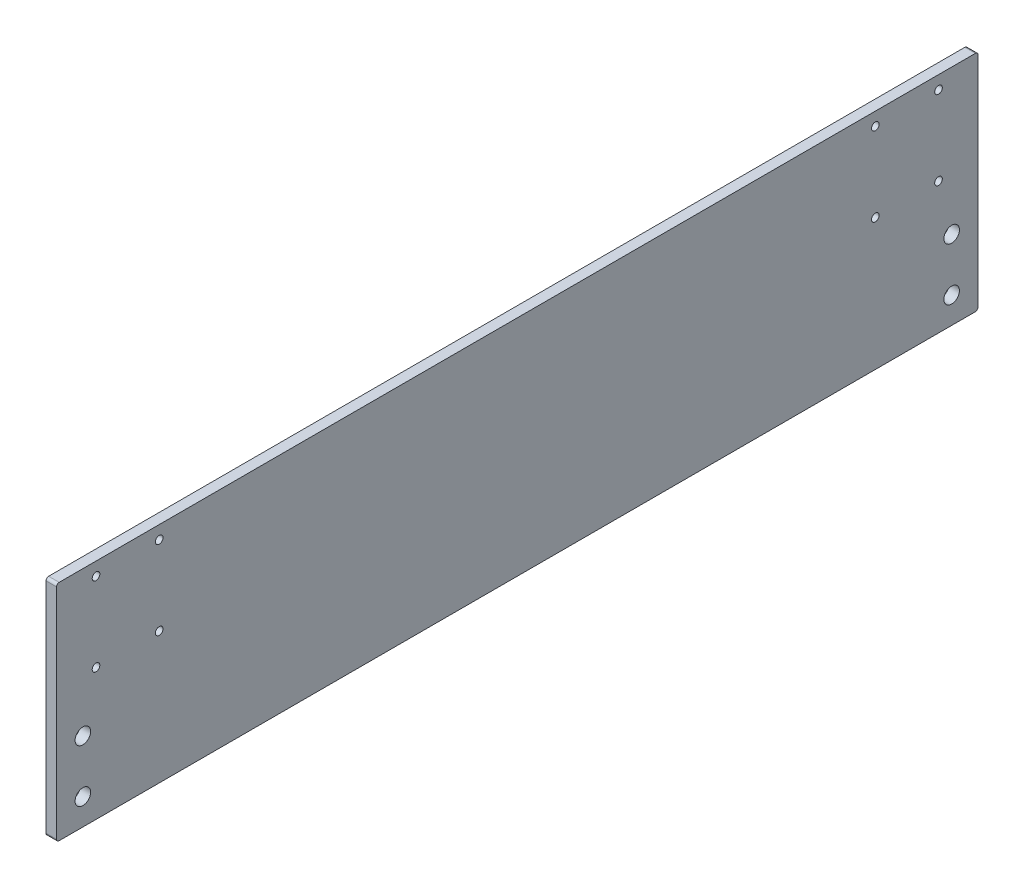
ISO-10303-21;
HEADER;
FILE_DESCRIPTION(('STEP AP214'),'2;1');
FILE_NAME('part.step','',(''),(''),'','','');
FILE_SCHEMA(('AUTOMOTIVE_DESIGN { 1 0 10303 214 1 1 1 1 }'));
ENDSEC;
DATA;
#1=APPLICATION_CONTEXT('core data for automotive mechanical design processes');
#2=APPLICATION_PROTOCOL_DEFINITION('international standard','automotive_design',2000,#1);
#3=PRODUCT_CONTEXT('',#1,'mechanical');
#4=PRODUCT('Part','Part','',(#3));
#5=PRODUCT_RELATED_PRODUCT_CATEGORY('part','',(#4));
#6=PRODUCT_DEFINITION_FORMATION('','',#4);
#7=PRODUCT_DEFINITION_CONTEXT('part definition',#1,'design');
#8=PRODUCT_DEFINITION('design','',#6,#7);
#9=PRODUCT_DEFINITION_SHAPE('','',#8);
#10=(LENGTH_UNIT() NAMED_UNIT(*) SI_UNIT(.MILLI.,.METRE.));
#11=(NAMED_UNIT(*) PLANE_ANGLE_UNIT() SI_UNIT($,.RADIAN.));
#12=(NAMED_UNIT(*) SI_UNIT($,.STERADIAN.) SOLID_ANGLE_UNIT());
#13=UNCERTAINTY_MEASURE_WITH_UNIT(LENGTH_MEASURE(1.E-05),#10,'distance_accuracy_value','');
#14=(GEOMETRIC_REPRESENTATION_CONTEXT(3) GLOBAL_UNCERTAINTY_ASSIGNED_CONTEXT((#13)) GLOBAL_UNIT_ASSIGNED_CONTEXT((#10,
#11,#12)) REPRESENTATION_CONTEXT('',''));
#15=CARTESIAN_POINT('',(0.,0.,0.));
#16=DIRECTION('',(0.,0.,1.));
#17=DIRECTION('',(1.,0.,0.));
#18=AXIS2_PLACEMENT_3D('',#15,#16,#17);
#19=CARTESIAN_POINT('',(4.,0.,0.));
#20=DIRECTION('',(-1.,0.,0.));
#21=DIRECTION('',(0.,0.,1.));
#22=AXIS2_PLACEMENT_3D('',#19,#20,#21);
#23=PLANE('',#22);
#24=DIRECTION('',(0.,0.,-1.));
#25=VECTOR('',#24,1.);
#26=CARTESIAN_POINT('',(4.,0.,0.));
#27=LINE('',#26,#25);
#28=CARTESIAN_POINT('',(4.,0.,-1.));
#29=VERTEX_POINT('',#28);
#30=CARTESIAN_POINT('',(4.,0.,-349.));
#31=VERTEX_POINT('',#30);
#32=EDGE_CURVE('E173',#29,#31,#27,.T.);
#33=ORIENTED_EDGE('',*,*,#32,.T.);
#34=CARTESIAN_POINT('',(4.,1.00000000000004,-349.));
#35=DIRECTION('',(-1.,0.,0.));
#36=DIRECTION('',(0.,0.,1.));
#37=AXIS2_PLACEMENT_3D('',#34,#35,#36);
#38=CIRCLE('',#37,1.);
#39=CARTESIAN_POINT('',(4.,1.00000000000004,-350.));
#40=VERTEX_POINT('',#39);
#41=EDGE_CURVE('E150',#31,#40,#38,.F.);
#42=ORIENTED_EDGE('',*,*,#41,.T.);
#43=DIRECTION('',(0.,1.,0.));
#44=VECTOR('',#43,1.);
#45=CARTESIAN_POINT('',(4.,0.,-350.));
#46=LINE('',#45,#44);
#47=CARTESIAN_POINT('',(4.,84.,-350.));
#48=VERTEX_POINT('',#47);
#49=EDGE_CURVE('E120',#40,#48,#46,.T.);
#50=ORIENTED_EDGE('',*,*,#49,.T.);
#51=CARTESIAN_POINT('',(4.,84.,-349.));
#52=DIRECTION('',(-1.,0.,0.));
#53=DIRECTION('',(0.,0.,1.));
#54=AXIS2_PLACEMENT_3D('',#51,#52,#53);
#55=CIRCLE('',#54,1.);
#56=CARTESIAN_POINT('',(4.,85.,-349.));
#57=VERTEX_POINT('',#56);
#58=EDGE_CURVE('E57',#48,#57,#55,.F.);
#59=ORIENTED_EDGE('',*,*,#58,.T.);
#60=DIRECTION('',(0.,0.,1.));
#61=VECTOR('',#60,1.);
#62=CARTESIAN_POINT('',(4.,85.,0.));
#63=LINE('',#62,#61);
#64=CARTESIAN_POINT('',(4.,85.,-1.));
#65=VERTEX_POINT('',#64);
#66=EDGE_CURVE('E136',#57,#65,#63,.T.);
#67=ORIENTED_EDGE('',*,*,#66,.T.);
#68=CARTESIAN_POINT('',(4.,84.,-1.));
#69=DIRECTION('',(-1.,0.,0.));
#70=DIRECTION('',(0.,0.,1.));
#71=AXIS2_PLACEMENT_3D('',#68,#69,#70);
#72=CIRCLE('',#71,1.);
#73=CARTESIAN_POINT('',(4.,84.,0.));
#74=VERTEX_POINT('',#73);
#75=EDGE_CURVE('E145',#65,#74,#72,.F.);
#76=ORIENTED_EDGE('',*,*,#75,.T.);
#77=DIRECTION('',(0.,-1.,0.));
#78=VECTOR('',#77,1.);
#79=CARTESIAN_POINT('',(4.,0.,0.));
#80=LINE('',#79,#78);
#81=CARTESIAN_POINT('',(4.,1.,0.));
#82=VERTEX_POINT('',#81);
#83=EDGE_CURVE('E130',#74,#82,#80,.T.);
#84=ORIENTED_EDGE('',*,*,#83,.T.);
#85=CARTESIAN_POINT('',(4.,1.,-1.));
#86=DIRECTION('',(-1.,0.,0.));
#87=DIRECTION('',(0.,0.,1.));
#88=AXIS2_PLACEMENT_3D('',#85,#86,#87);
#89=CIRCLE('',#88,1.);
#90=EDGE_CURVE('E147',#82,#29,#89,.F.);
#91=ORIENTED_EDGE('',*,*,#90,.T.);
#92=EDGE_LOOP('',(#33,#42,#50,#59,#67,#76,#84,#91));
#93=FACE_BOUND('',#92,.T.);
#94=CARTESIAN_POINT('',(4.,30.,-10.));
#95=DIRECTION('',(1.,0.,0.));
#96=DIRECTION('',(0.,0.,-1.));
#97=AXIS2_PLACEMENT_3D('',#94,#95,#96);
#98=CIRCLE('',#97,2.95);
#99=CARTESIAN_POINT('',(4.,30.,-12.95));
#100=VERTEX_POINT('',#99);
#101=EDGE_CURVE('E166',#100,#100,#98,.T.);
#102=ORIENTED_EDGE('',*,*,#101,.F.);
#103=EDGE_LOOP('',(#102));
#104=FACE_BOUND('',#103,.T.);
#105=CARTESIAN_POINT('',(4.,10.,-9.99999999999999));
#106=DIRECTION('',(1.,0.,0.));
#107=DIRECTION('',(0.,0.,-1.));
#108=AXIS2_PLACEMENT_3D('',#105,#106,#107);
#109=CIRCLE('',#108,2.95);
#110=CARTESIAN_POINT('',(4.,10.,-12.95));
#111=VERTEX_POINT('',#110);
#112=EDGE_CURVE('E178',#111,#111,#109,.T.);
#113=ORIENTED_EDGE('',*,*,#112,.F.);
#114=EDGE_LOOP('',(#113));
#115=FACE_BOUND('',#114,.T.);
#116=CARTESIAN_POINT('',(4.,80.,-15.));
#117=DIRECTION('',(1.,0.,0.));
#118=DIRECTION('',(0.,0.,-1.));
#119=AXIS2_PLACEMENT_3D('',#116,#117,#118);
#120=CIRCLE('',#119,1.45000000000001);
#121=CARTESIAN_POINT('',(4.,80.,-16.45));
#122=VERTEX_POINT('',#121);
#123=EDGE_CURVE('E183',#122,#122,#120,.T.);
#124=ORIENTED_EDGE('',*,*,#123,.F.);
#125=EDGE_LOOP('',(#124));
#126=FACE_BOUND('',#125,.T.);
#127=CARTESIAN_POINT('',(4.,80.,-39.));
#128=DIRECTION('',(1.,0.,0.));
#129=DIRECTION('',(0.,0.,-1.));
#130=AXIS2_PLACEMENT_3D('',#127,#128,#129);
#131=CIRCLE('',#130,1.45);
#132=CARTESIAN_POINT('',(4.,80.,-40.45));
#133=VERTEX_POINT('',#132);
#134=EDGE_CURVE('E189',#133,#133,#131,.T.);
#135=ORIENTED_EDGE('',*,*,#134,.F.);
#136=EDGE_LOOP('',(#135));
#137=FACE_BOUND('',#136,.T.);
#138=CARTESIAN_POINT('',(4.,50.,-15.));
#139=DIRECTION('',(1.,0.,0.));
#140=DIRECTION('',(0.,0.,-1.));
#141=AXIS2_PLACEMENT_3D('',#138,#139,#140);
#142=CIRCLE('',#141,1.45);
#143=CARTESIAN_POINT('',(4.,50.,-16.45));
#144=VERTEX_POINT('',#143);
#145=EDGE_CURVE('E195',#144,#144,#142,.T.);
#146=ORIENTED_EDGE('',*,*,#145,.F.);
#147=EDGE_LOOP('',(#146));
#148=FACE_BOUND('',#147,.T.);
#149=CARTESIAN_POINT('',(4.,50.,-39.));
#150=DIRECTION('',(1.,0.,0.));
#151=DIRECTION('',(0.,0.,-1.));
#152=AXIS2_PLACEMENT_3D('',#149,#150,#151);
#153=CIRCLE('',#152,1.45);
#154=CARTESIAN_POINT('',(4.,50.,-40.45));
#155=VERTEX_POINT('',#154);
#156=EDGE_CURVE('E201',#155,#155,#153,.T.);
#157=ORIENTED_EDGE('',*,*,#156,.F.);
#158=EDGE_LOOP('',(#157));
#159=FACE_BOUND('',#158,.T.);
#160=CARTESIAN_POINT('',(4.,50.,-311.));
#161=DIRECTION('',(1.,0.,0.));
#162=DIRECTION('',(0.,0.,1.));
#163=AXIS2_PLACEMENT_3D('',#160,#161,#162);
#164=CIRCLE('',#163,1.45);
#165=CARTESIAN_POINT('',(4.,50.,-309.55));
#166=VERTEX_POINT('',#165);
#167=EDGE_CURVE('E207',#166,#166,#164,.T.);
#168=ORIENTED_EDGE('',*,*,#167,.F.);
#169=EDGE_LOOP('',(#168));
#170=FACE_BOUND('',#169,.T.);
#171=CARTESIAN_POINT('',(4.,50.,-335.));
#172=DIRECTION('',(1.,0.,0.));
#173=DIRECTION('',(0.,0.,1.));
#174=AXIS2_PLACEMENT_3D('',#171,#172,#173);
#175=CIRCLE('',#174,1.45);
#176=CARTESIAN_POINT('',(4.,50.,-333.55));
#177=VERTEX_POINT('',#176);
#178=EDGE_CURVE('E213',#177,#177,#175,.T.);
#179=ORIENTED_EDGE('',*,*,#178,.F.);
#180=EDGE_LOOP('',(#179));
#181=FACE_BOUND('',#180,.T.);
#182=CARTESIAN_POINT('',(4.,80.,-311.));
#183=DIRECTION('',(1.,0.,0.));
#184=DIRECTION('',(0.,0.,1.));
#185=AXIS2_PLACEMENT_3D('',#182,#183,#184);
#186=CIRCLE('',#185,1.45);
#187=CARTESIAN_POINT('',(4.,80.,-309.55));
#188=VERTEX_POINT('',#187);
#189=EDGE_CURVE('E219',#188,#188,#186,.T.);
#190=ORIENTED_EDGE('',*,*,#189,.F.);
#191=EDGE_LOOP('',(#190));
#192=FACE_BOUND('',#191,.T.);
#193=CARTESIAN_POINT('',(4.,80.,-335.));
#194=DIRECTION('',(1.,0.,0.));
#195=DIRECTION('',(0.,0.,1.));
#196=AXIS2_PLACEMENT_3D('',#193,#194,#195);
#197=CIRCLE('',#196,1.45);
#198=CARTESIAN_POINT('',(4.,80.,-333.55));
#199=VERTEX_POINT('',#198);
#200=EDGE_CURVE('E225',#199,#199,#197,.T.);
#201=ORIENTED_EDGE('',*,*,#200,.F.);
#202=EDGE_LOOP('',(#201));
#203=FACE_BOUND('',#202,.T.);
#204=CARTESIAN_POINT('',(4.,10.,-340.));
#205=DIRECTION('',(1.,0.,0.));
#206=DIRECTION('',(0.,0.,1.));
#207=AXIS2_PLACEMENT_3D('',#204,#205,#206);
#208=CIRCLE('',#207,2.94999999999997);
#209=CARTESIAN_POINT('',(4.,10.,-337.05));
#210=VERTEX_POINT('',#209);
#211=EDGE_CURVE('E231',#210,#210,#208,.T.);
#212=ORIENTED_EDGE('',*,*,#211,.F.);
#213=EDGE_LOOP('',(#212));
#214=FACE_BOUND('',#213,.T.);
#215=CARTESIAN_POINT('',(4.,30.,-340.));
#216=DIRECTION('',(1.,0.,0.));
#217=DIRECTION('',(0.,0.,1.));
#218=AXIS2_PLACEMENT_3D('',#215,#216,#217);
#219=CIRCLE('',#218,2.95000000000002);
#220=CARTESIAN_POINT('',(4.,30.,-337.05));
#221=VERTEX_POINT('',#220);
#222=EDGE_CURVE('E237',#221,#221,#219,.T.);
#223=ORIENTED_EDGE('',*,*,#222,.F.);
#224=EDGE_LOOP('',(#223));
#225=FACE_BOUND('',#224,.T.);
#226=ADVANCED_FACE('F35',(#93,#104,#115,#126,#137,#148,#159,#170,#181,#192,#203,#214,#225),#23,.F.);
#227=CARTESIAN_POINT('',(0.,0.,0.));
#228=DIRECTION('',(-1.,0.,0.));
#229=DIRECTION('',(0.,0.,1.));
#230=AXIS2_PLACEMENT_3D('',#227,#228,#229);
#231=PLANE('',#230);
#232=CARTESIAN_POINT('',(0.,10.,-340.));
#233=DIRECTION('',(1.,0.,0.));
#234=DIRECTION('',(0.,0.,1.));
#235=AXIS2_PLACEMENT_3D('',#232,#233,#234);
#236=CIRCLE('',#235,2.94999999999997);
#237=CARTESIAN_POINT('',(0.,10.,-337.05));
#238=VERTEX_POINT('',#237);
#239=EDGE_CURVE('E234',#238,#238,#236,.T.);
#240=ORIENTED_EDGE('',*,*,#239,.T.);
#241=EDGE_LOOP('',(#240));
#242=FACE_BOUND('',#241,.T.);
#243=CARTESIAN_POINT('',(0.,80.,-311.));
#244=DIRECTION('',(1.,0.,0.));
#245=DIRECTION('',(0.,0.,1.));
#246=AXIS2_PLACEMENT_3D('',#243,#244,#245);
#247=CIRCLE('',#246,1.45);
#248=CARTESIAN_POINT('',(0.,80.,-309.55));
#249=VERTEX_POINT('',#248);
#250=EDGE_CURVE('E222',#249,#249,#247,.T.);
#251=ORIENTED_EDGE('',*,*,#250,.T.);
#252=EDGE_LOOP('',(#251));
#253=FACE_BOUND('',#252,.T.);
#254=CARTESIAN_POINT('',(0.,50.,-311.));
#255=DIRECTION('',(1.,0.,0.));
#256=DIRECTION('',(0.,0.,1.));
#257=AXIS2_PLACEMENT_3D('',#254,#255,#256);
#258=CIRCLE('',#257,1.45);
#259=CARTESIAN_POINT('',(0.,50.,-309.55));
#260=VERTEX_POINT('',#259);
#261=EDGE_CURVE('E210',#260,#260,#258,.T.);
#262=ORIENTED_EDGE('',*,*,#261,.T.);
#263=EDGE_LOOP('',(#262));
#264=FACE_BOUND('',#263,.T.);
#265=CARTESIAN_POINT('',(0.,50.,-15.));
#266=DIRECTION('',(1.,0.,0.));
#267=DIRECTION('',(0.,0.,-1.));
#268=AXIS2_PLACEMENT_3D('',#265,#266,#267);
#269=CIRCLE('',#268,1.45);
#270=CARTESIAN_POINT('',(0.,50.,-16.45));
#271=VERTEX_POINT('',#270);
#272=EDGE_CURVE('E198',#271,#271,#269,.T.);
#273=ORIENTED_EDGE('',*,*,#272,.T.);
#274=EDGE_LOOP('',(#273));
#275=FACE_BOUND('',#274,.T.);
#276=CARTESIAN_POINT('',(0.,80.,-15.));
#277=DIRECTION('',(1.,0.,0.));
#278=DIRECTION('',(0.,0.,-1.));
#279=AXIS2_PLACEMENT_3D('',#276,#277,#278);
#280=CIRCLE('',#279,1.45000000000001);
#281=CARTESIAN_POINT('',(0.,80.,-16.45));
#282=VERTEX_POINT('',#281);
#283=EDGE_CURVE('E186',#282,#282,#280,.T.);
#284=ORIENTED_EDGE('',*,*,#283,.T.);
#285=EDGE_LOOP('',(#284));
#286=FACE_BOUND('',#285,.T.);
#287=CARTESIAN_POINT('',(0.,30.,-10.));
#288=DIRECTION('',(1.,0.,0.));
#289=DIRECTION('',(0.,0.,-1.));
#290=AXIS2_PLACEMENT_3D('',#287,#288,#289);
#291=CIRCLE('',#290,2.95);
#292=CARTESIAN_POINT('',(0.,30.,-12.95));
#293=VERTEX_POINT('',#292);
#294=EDGE_CURVE('E168',#293,#293,#291,.T.);
#295=ORIENTED_EDGE('',*,*,#294,.T.);
#296=EDGE_LOOP('',(#295));
#297=FACE_BOUND('',#296,.T.);
#298=DIRECTION('',(0.,1.,0.));
#299=VECTOR('',#298,1.);
#300=CARTESIAN_POINT('',(0.,0.,-350.));
#301=LINE('',#300,#299);
#302=CARTESIAN_POINT('',(0.,1.00000000000004,-350.));
#303=VERTEX_POINT('',#302);
#304=CARTESIAN_POINT('',(0.,84.,-350.));
#305=VERTEX_POINT('',#304);
#306=EDGE_CURVE('E118',#303,#305,#301,.T.);
#307=ORIENTED_EDGE('',*,*,#306,.F.);
#308=CARTESIAN_POINT('',(0.,1.00000000000004,-349.));
#309=DIRECTION('',(-1.,0.,0.));
#310=DIRECTION('',(0.,0.,1.));
#311=AXIS2_PLACEMENT_3D('',#308,#309,#310);
#312=CIRCLE('',#311,1.);
#313=CARTESIAN_POINT('',(0.,0.,-349.));
#314=VERTEX_POINT('',#313);
#315=EDGE_CURVE('E101',#303,#314,#312,.T.);
#316=ORIENTED_EDGE('',*,*,#315,.T.);
#317=DIRECTION('',(0.,0.,-1.));
#318=VECTOR('',#317,1.);
#319=CARTESIAN_POINT('',(0.,0.,0.));
#320=LINE('',#319,#318);
#321=CARTESIAN_POINT('',(0.,0.,-1.));
#322=VERTEX_POINT('',#321);
#323=EDGE_CURVE('E128',#322,#314,#320,.T.);
#324=ORIENTED_EDGE('',*,*,#323,.F.);
#325=CARTESIAN_POINT('',(0.,1.,-1.));
#326=DIRECTION('',(-1.,0.,0.));
#327=DIRECTION('',(0.,0.,1.));
#328=AXIS2_PLACEMENT_3D('',#325,#326,#327);
#329=CIRCLE('',#328,1.);
#330=CARTESIAN_POINT('',(0.,1.,0.));
#331=VERTEX_POINT('',#330);
#332=EDGE_CURVE('E139',#322,#331,#329,.T.);
#333=ORIENTED_EDGE('',*,*,#332,.T.);
#334=DIRECTION('',(0.,-1.,0.));
#335=VECTOR('',#334,1.);
#336=CARTESIAN_POINT('',(0.,0.,0.));
#337=LINE('',#336,#335);
#338=CARTESIAN_POINT('',(0.,84.,0.));
#339=VERTEX_POINT('',#338);
#340=EDGE_CURVE('E132',#339,#331,#337,.T.);
#341=ORIENTED_EDGE('',*,*,#340,.F.);
#342=CARTESIAN_POINT('',(0.,84.,-1.));
#343=DIRECTION('',(-1.,0.,0.));
#344=DIRECTION('',(0.,0.,1.));
#345=AXIS2_PLACEMENT_3D('',#342,#343,#344);
#346=CIRCLE('',#345,1.);
#347=CARTESIAN_POINT('',(0.,85.,-1.));
#348=VERTEX_POINT('',#347);
#349=EDGE_CURVE('E121',#339,#348,#346,.T.);
#350=ORIENTED_EDGE('',*,*,#349,.T.);
#351=DIRECTION('',(0.,0.,1.));
#352=VECTOR('',#351,1.);
#353=CARTESIAN_POINT('',(0.,85.,0.));
#354=LINE('',#353,#352);
#355=CARTESIAN_POINT('',(0.,85.,-349.));
#356=VERTEX_POINT('',#355);
#357=EDGE_CURVE('E127',#356,#348,#354,.T.);
#358=ORIENTED_EDGE('',*,*,#357,.F.);
#359=CARTESIAN_POINT('',(0.,84.,-349.));
#360=DIRECTION('',(-1.,0.,0.));
#361=DIRECTION('',(0.,0.,1.));
#362=AXIS2_PLACEMENT_3D('',#359,#360,#361);
#363=CIRCLE('',#362,1.);
#364=EDGE_CURVE('E112',#356,#305,#363,.T.);
#365=ORIENTED_EDGE('',*,*,#364,.T.);
#366=EDGE_LOOP('',(#307,#316,#324,#333,#341,#350,#358,#365));
#367=FACE_BOUND('',#366,.T.);
#368=CARTESIAN_POINT('',(0.,10.,-9.99999999999999));
#369=DIRECTION('',(1.,0.,0.));
#370=DIRECTION('',(0.,0.,-1.));
#371=AXIS2_PLACEMENT_3D('',#368,#369,#370);
#372=CIRCLE('',#371,2.95);
#373=CARTESIAN_POINT('',(0.,10.,-12.95));
#374=VERTEX_POINT('',#373);
#375=EDGE_CURVE('E180',#374,#374,#372,.T.);
#376=ORIENTED_EDGE('',*,*,#375,.T.);
#377=EDGE_LOOP('',(#376));
#378=FACE_BOUND('',#377,.T.);
#379=CARTESIAN_POINT('',(0.,80.,-39.));
#380=DIRECTION('',(1.,0.,0.));
#381=DIRECTION('',(0.,0.,-1.));
#382=AXIS2_PLACEMENT_3D('',#379,#380,#381);
#383=CIRCLE('',#382,1.45);
#384=CARTESIAN_POINT('',(0.,80.,-40.45));
#385=VERTEX_POINT('',#384);
#386=EDGE_CURVE('E192',#385,#385,#383,.T.);
#387=ORIENTED_EDGE('',*,*,#386,.T.);
#388=EDGE_LOOP('',(#387));
#389=FACE_BOUND('',#388,.T.);
#390=CARTESIAN_POINT('',(0.,50.,-39.));
#391=DIRECTION('',(1.,0.,0.));
#392=DIRECTION('',(0.,0.,-1.));
#393=AXIS2_PLACEMENT_3D('',#390,#391,#392);
#394=CIRCLE('',#393,1.45);
#395=CARTESIAN_POINT('',(0.,50.,-40.45));
#396=VERTEX_POINT('',#395);
#397=EDGE_CURVE('E204',#396,#396,#394,.T.);
#398=ORIENTED_EDGE('',*,*,#397,.T.);
#399=EDGE_LOOP('',(#398));
#400=FACE_BOUND('',#399,.T.);
#401=CARTESIAN_POINT('',(0.,50.,-335.));
#402=DIRECTION('',(1.,0.,0.));
#403=DIRECTION('',(0.,0.,1.));
#404=AXIS2_PLACEMENT_3D('',#401,#402,#403);
#405=CIRCLE('',#404,1.45);
#406=CARTESIAN_POINT('',(0.,50.,-333.55));
#407=VERTEX_POINT('',#406);
#408=EDGE_CURVE('E216',#407,#407,#405,.T.);
#409=ORIENTED_EDGE('',*,*,#408,.T.);
#410=EDGE_LOOP('',(#409));
#411=FACE_BOUND('',#410,.T.);
#412=CARTESIAN_POINT('',(0.,80.,-335.));
#413=DIRECTION('',(1.,0.,0.));
#414=DIRECTION('',(0.,0.,1.));
#415=AXIS2_PLACEMENT_3D('',#412,#413,#414);
#416=CIRCLE('',#415,1.45);
#417=CARTESIAN_POINT('',(0.,80.,-333.55));
#418=VERTEX_POINT('',#417);
#419=EDGE_CURVE('E228',#418,#418,#416,.T.);
#420=ORIENTED_EDGE('',*,*,#419,.T.);
#421=EDGE_LOOP('',(#420));
#422=FACE_BOUND('',#421,.T.);
#423=CARTESIAN_POINT('',(0.,30.,-340.));
#424=DIRECTION('',(1.,0.,0.));
#425=DIRECTION('',(0.,0.,1.));
#426=AXIS2_PLACEMENT_3D('',#423,#424,#425);
#427=CIRCLE('',#426,2.95000000000002);
#428=CARTESIAN_POINT('',(0.,30.,-337.05));
#429=VERTEX_POINT('',#428);
#430=EDGE_CURVE('E240',#429,#429,#427,.T.);
#431=ORIENTED_EDGE('',*,*,#430,.T.);
#432=EDGE_LOOP('',(#431));
#433=FACE_BOUND('',#432,.T.);
#434=ADVANCED_FACE('F124',(#242,#253,#264,#275,#286,#297,#367,#378,#389,#400,#411,#422,#433),
#231,.T.);
#435=CARTESIAN_POINT('',(4.,0.,0.));
#436=DIRECTION('',(0.,0.,-1.));
#437=DIRECTION('',(-1.,0.,0.));
#438=AXIS2_PLACEMENT_3D('',#435,#436,#437);
#439=PLANE('',#438);
#440=ORIENTED_EDGE('',*,*,#340,.T.);
#441=DIRECTION('',(-1.,0.,0.));
#442=VECTOR('',#441,1.);
#443=CARTESIAN_POINT('',(4.,1.,0.));
#444=LINE('',#443,#442);
#445=EDGE_CURVE('E11',#331,#82,#444,.F.);
#446=ORIENTED_EDGE('',*,*,#445,.T.);
#447=ORIENTED_EDGE('',*,*,#83,.F.);
#448=DIRECTION('',(-1.,0.,0.));
#449=VECTOR('',#448,1.);
#450=CARTESIAN_POINT('',(4.,84.,0.));
#451=LINE('',#450,#449);
#452=EDGE_CURVE('E43',#74,#339,#451,.T.);
#453=ORIENTED_EDGE('',*,*,#452,.T.);
#454=EDGE_LOOP('',(#440,#446,#447,#453));
#455=FACE_BOUND('',#454,.T.);
#456=ADVANCED_FACE('F161',(#455),#439,.F.);
#457=CARTESIAN_POINT('',(4.,0.,0.));
#458=DIRECTION('',(0.,1.,0.));
#459=DIRECTION('',(0.,0.,1.));
#460=AXIS2_PLACEMENT_3D('',#457,#458,#459);
#461=PLANE('',#460);
#462=ORIENTED_EDGE('',*,*,#323,.T.);
#463=DIRECTION('',(-1.,0.,0.));
#464=VECTOR('',#463,1.);
#465=CARTESIAN_POINT('',(4.,0.,-349.));
#466=LINE('',#465,#464);
#467=EDGE_CURVE('E106',#314,#31,#466,.F.);
#468=ORIENTED_EDGE('',*,*,#467,.T.);
#469=ORIENTED_EDGE('',*,*,#32,.F.);
#470=DIRECTION('',(-1.,0.,0.));
#471=VECTOR('',#470,1.);
#472=CARTESIAN_POINT('',(4.,0.,-1.));
#473=LINE('',#472,#471);
#474=EDGE_CURVE('E111',#29,#322,#473,.T.);
#475=ORIENTED_EDGE('',*,*,#474,.T.);
#476=EDGE_LOOP('',(#462,#468,#469,#475));
#477=FACE_BOUND('',#476,.T.);
#478=ADVANCED_FACE('F266',(#477),#461,.F.);
#479=CARTESIAN_POINT('',(4.,0.,-350.));
#480=DIRECTION('',(0.,0.,1.));
#481=DIRECTION('',(1.,0.,0.));
#482=AXIS2_PLACEMENT_3D('',#479,#480,#481);
#483=PLANE('',#482);
#484=ORIENTED_EDGE('',*,*,#49,.F.);
#485=DIRECTION('',(-1.,0.,0.));
#486=VECTOR('',#485,1.);
#487=CARTESIAN_POINT('',(4.,1.00000000000004,-350.));
#488=LINE('',#487,#486);
#489=EDGE_CURVE('E105',#40,#303,#488,.T.);
#490=ORIENTED_EDGE('',*,*,#489,.T.);
#491=ORIENTED_EDGE('',*,*,#306,.T.);
#492=DIRECTION('',(-1.,0.,0.));
#493=VECTOR('',#492,1.);
#494=CARTESIAN_POINT('',(4.,84.,-350.));
#495=LINE('',#494,#493);
#496=EDGE_CURVE('E122',#305,#48,#495,.F.);
#497=ORIENTED_EDGE('',*,*,#496,.T.);
#498=EDGE_LOOP('',(#484,#490,#491,#497));
#499=FACE_BOUND('',#498,.T.);
#500=ADVANCED_FACE('F117',(#499),#483,.F.);
#501=CARTESIAN_POINT('',(4.,85.,0.));
#502=DIRECTION('',(0.,-1.,0.));
#503=DIRECTION('',(0.,0.,-1.));
#504=AXIS2_PLACEMENT_3D('',#501,#502,#503);
#505=PLANE('',#504);
#506=ORIENTED_EDGE('',*,*,#66,.F.);
#507=DIRECTION('',(-1.,0.,0.));
#508=VECTOR('',#507,1.);
#509=CARTESIAN_POINT('',(4.,85.,-349.));
#510=LINE('',#509,#508);
#511=EDGE_CURVE('E153',#57,#356,#510,.T.);
#512=ORIENTED_EDGE('',*,*,#511,.T.);
#513=ORIENTED_EDGE('',*,*,#357,.T.);
#514=DIRECTION('',(-1.,0.,0.));
#515=VECTOR('',#514,1.);
#516=CARTESIAN_POINT('',(4.,85.,-1.));
#517=LINE('',#516,#515);
#518=EDGE_CURVE('E50',#348,#65,#517,.F.);
#519=ORIENTED_EDGE('',*,*,#518,.T.);
#520=EDGE_LOOP('',(#506,#512,#513,#519));
#521=FACE_BOUND('',#520,.T.);
#522=ADVANCED_FACE('F261',(#521),#505,.F.);
#523=CARTESIAN_POINT('',(4.,30.,-10.));
#524=DIRECTION('',(-1.,0.,0.));
#525=DIRECTION('',(0.,0.,1.));
#526=AXIS2_PLACEMENT_3D('',#523,#524,#525);
#527=CYLINDRICAL_SURFACE('',#526,2.95);
#528=ORIENTED_EDGE('',*,*,#101,.T.);
#529=EDGE_LOOP('',(#528));
#530=FACE_BOUND('',#529,.T.);
#531=ORIENTED_EDGE('',*,*,#294,.F.);
#532=EDGE_LOOP('',(#531));
#533=FACE_BOUND('',#532,.T.);
#534=ADVANCED_FACE('F258',(#530,#533),#527,.F.);
#535=CARTESIAN_POINT('',(4.,10.,-9.99999999999999));
#536=DIRECTION('',(-1.,0.,0.));
#537=DIRECTION('',(0.,0.,1.));
#538=AXIS2_PLACEMENT_3D('',#535,#536,#537);
#539=CYLINDRICAL_SURFACE('',#538,2.95);
#540=ORIENTED_EDGE('',*,*,#112,.T.);
#541=EDGE_LOOP('',(#540));
#542=FACE_BOUND('',#541,.T.);
#543=ORIENTED_EDGE('',*,*,#375,.F.);
#544=EDGE_LOOP('',(#543));
#545=FACE_BOUND('',#544,.T.);
#546=ADVANCED_FACE('F439',(#542,#545),#539,.F.);
#547=CARTESIAN_POINT('',(4.,80.,-15.));
#548=DIRECTION('',(-1.,0.,0.));
#549=DIRECTION('',(0.,0.,1.));
#550=AXIS2_PLACEMENT_3D('',#547,#548,#549);
#551=CYLINDRICAL_SURFACE('',#550,1.45000000000001);
#552=ORIENTED_EDGE('',*,*,#123,.T.);
#553=EDGE_LOOP('',(#552));
#554=FACE_BOUND('',#553,.T.);
#555=ORIENTED_EDGE('',*,*,#283,.F.);
#556=EDGE_LOOP('',(#555));
#557=FACE_BOUND('',#556,.T.);
#558=ADVANCED_FACE('F429',(#554,#557),#551,.F.);
#559=CARTESIAN_POINT('',(4.,80.,-39.));
#560=DIRECTION('',(-1.,0.,0.));
#561=DIRECTION('',(0.,0.,1.));
#562=AXIS2_PLACEMENT_3D('',#559,#560,#561);
#563=CYLINDRICAL_SURFACE('',#562,1.45);
#564=ORIENTED_EDGE('',*,*,#134,.T.);
#565=EDGE_LOOP('',(#564));
#566=FACE_BOUND('',#565,.T.);
#567=ORIENTED_EDGE('',*,*,#386,.F.);
#568=EDGE_LOOP('',(#567));
#569=FACE_BOUND('',#568,.T.);
#570=ADVANCED_FACE('F419',(#566,#569),#563,.F.);
#571=CARTESIAN_POINT('',(4.,50.,-15.));
#572=DIRECTION('',(-1.,0.,0.));
#573=DIRECTION('',(0.,0.,1.));
#574=AXIS2_PLACEMENT_3D('',#571,#572,#573);
#575=CYLINDRICAL_SURFACE('',#574,1.45);
#576=ORIENTED_EDGE('',*,*,#145,.T.);
#577=EDGE_LOOP('',(#576));
#578=FACE_BOUND('',#577,.T.);
#579=ORIENTED_EDGE('',*,*,#272,.F.);
#580=EDGE_LOOP('',(#579));
#581=FACE_BOUND('',#580,.T.);
#582=ADVANCED_FACE('F409',(#578,#581),#575,.F.);
#583=CARTESIAN_POINT('',(4.,50.,-39.));
#584=DIRECTION('',(-1.,0.,0.));
#585=DIRECTION('',(0.,0.,1.));
#586=AXIS2_PLACEMENT_3D('',#583,#584,#585);
#587=CYLINDRICAL_SURFACE('',#586,1.45);
#588=ORIENTED_EDGE('',*,*,#156,.T.);
#589=EDGE_LOOP('',(#588));
#590=FACE_BOUND('',#589,.T.);
#591=ORIENTED_EDGE('',*,*,#397,.F.);
#592=EDGE_LOOP('',(#591));
#593=FACE_BOUND('',#592,.T.);
#594=ADVANCED_FACE('F399',(#590,#593),#587,.F.);
#595=CARTESIAN_POINT('',(4.,50.,-311.));
#596=DIRECTION('',(-1.,0.,0.));
#597=DIRECTION('',(0.,0.,1.));
#598=AXIS2_PLACEMENT_3D('',#595,#596,#597);
#599=CYLINDRICAL_SURFACE('',#598,1.45);
#600=ORIENTED_EDGE('',*,*,#167,.T.);
#601=EDGE_LOOP('',(#600));
#602=FACE_BOUND('',#601,.T.);
#603=ORIENTED_EDGE('',*,*,#261,.F.);
#604=EDGE_LOOP('',(#603));
#605=FACE_BOUND('',#604,.T.);
#606=ADVANCED_FACE('F389',(#602,#605),#599,.F.);
#607=CARTESIAN_POINT('',(4.,50.,-335.));
#608=DIRECTION('',(-1.,0.,0.));
#609=DIRECTION('',(0.,0.,1.));
#610=AXIS2_PLACEMENT_3D('',#607,#608,#609);
#611=CYLINDRICAL_SURFACE('',#610,1.45);
#612=ORIENTED_EDGE('',*,*,#178,.T.);
#613=EDGE_LOOP('',(#612));
#614=FACE_BOUND('',#613,.T.);
#615=ORIENTED_EDGE('',*,*,#408,.F.);
#616=EDGE_LOOP('',(#615));
#617=FACE_BOUND('',#616,.T.);
#618=ADVANCED_FACE('F379',(#614,#617),#611,.F.);
#619=CARTESIAN_POINT('',(4.,80.,-311.));
#620=DIRECTION('',(-1.,0.,0.));
#621=DIRECTION('',(0.,0.,1.));
#622=AXIS2_PLACEMENT_3D('',#619,#620,#621);
#623=CYLINDRICAL_SURFACE('',#622,1.45);
#624=ORIENTED_EDGE('',*,*,#189,.T.);
#625=EDGE_LOOP('',(#624));
#626=FACE_BOUND('',#625,.T.);
#627=ORIENTED_EDGE('',*,*,#250,.F.);
#628=EDGE_LOOP('',(#627));
#629=FACE_BOUND('',#628,.T.);
#630=ADVANCED_FACE('F369',(#626,#629),#623,.F.);
#631=CARTESIAN_POINT('',(4.,80.,-335.));
#632=DIRECTION('',(-1.,0.,0.));
#633=DIRECTION('',(0.,0.,1.));
#634=AXIS2_PLACEMENT_3D('',#631,#632,#633);
#635=CYLINDRICAL_SURFACE('',#634,1.45);
#636=ORIENTED_EDGE('',*,*,#200,.T.);
#637=EDGE_LOOP('',(#636));
#638=FACE_BOUND('',#637,.T.);
#639=ORIENTED_EDGE('',*,*,#419,.F.);
#640=EDGE_LOOP('',(#639));
#641=FACE_BOUND('',#640,.T.);
#642=ADVANCED_FACE('F359',(#638,#641),#635,.F.);
#643=CARTESIAN_POINT('',(4.,10.,-340.));
#644=DIRECTION('',(-1.,0.,0.));
#645=DIRECTION('',(0.,0.,1.));
#646=AXIS2_PLACEMENT_3D('',#643,#644,#645);
#647=CYLINDRICAL_SURFACE('',#646,2.94999999999997);
#648=ORIENTED_EDGE('',*,*,#211,.T.);
#649=EDGE_LOOP('',(#648));
#650=FACE_BOUND('',#649,.T.);
#651=ORIENTED_EDGE('',*,*,#239,.F.);
#652=EDGE_LOOP('',(#651));
#653=FACE_BOUND('',#652,.T.);
#654=ADVANCED_FACE('F350',(#650,#653),#647,.F.);
#655=CARTESIAN_POINT('',(4.,30.,-340.));
#656=DIRECTION('',(-1.,0.,0.));
#657=DIRECTION('',(0.,0.,1.));
#658=AXIS2_PLACEMENT_3D('',#655,#656,#657);
#659=CYLINDRICAL_SURFACE('',#658,2.95000000000002);
#660=ORIENTED_EDGE('',*,*,#222,.T.);
#661=EDGE_LOOP('',(#660));
#662=FACE_BOUND('',#661,.T.);
#663=ORIENTED_EDGE('',*,*,#430,.F.);
#664=EDGE_LOOP('',(#663));
#665=FACE_BOUND('',#664,.T.);
#666=ADVANCED_FACE('F246',(#662,#665),#659,.F.);
#667=CARTESIAN_POINT('',(4.,1.00000000000004,-349.));
#668=DIRECTION('',(-1.,0.,0.));
#669=DIRECTION('',(0.,0.,1.));
#670=AXIS2_PLACEMENT_3D('',#667,#668,#669);
#671=CYLINDRICAL_SURFACE('',#670,1.);
#672=ORIENTED_EDGE('',*,*,#41,.F.);
#673=ORIENTED_EDGE('',*,*,#467,.F.);
#674=ORIENTED_EDGE('',*,*,#315,.F.);
#675=ORIENTED_EDGE('',*,*,#489,.F.);
#676=EDGE_LOOP('',(#672,#673,#674,#675));
#677=FACE_BOUND('',#676,.T.);
#678=ADVANCED_FACE('F104',(#677),#671,.T.);
#679=CARTESIAN_POINT('',(4.,84.,-349.));
#680=DIRECTION('',(-1.,0.,0.));
#681=DIRECTION('',(0.,0.,1.));
#682=AXIS2_PLACEMENT_3D('',#679,#680,#681);
#683=CYLINDRICAL_SURFACE('',#682,1.);
#684=ORIENTED_EDGE('',*,*,#58,.F.);
#685=ORIENTED_EDGE('',*,*,#496,.F.);
#686=ORIENTED_EDGE('',*,*,#364,.F.);
#687=ORIENTED_EDGE('',*,*,#511,.F.);
#688=EDGE_LOOP('',(#684,#685,#686,#687));
#689=FACE_BOUND('',#688,.T.);
#690=ADVANCED_FACE('F274',(#689),#683,.T.);
#691=CARTESIAN_POINT('',(4.,1.,-1.));
#692=DIRECTION('',(-1.,0.,0.));
#693=DIRECTION('',(0.,0.,1.));
#694=AXIS2_PLACEMENT_3D('',#691,#692,#693);
#695=CYLINDRICAL_SURFACE('',#694,1.);
#696=ORIENTED_EDGE('',*,*,#90,.F.);
#697=ORIENTED_EDGE('',*,*,#445,.F.);
#698=ORIENTED_EDGE('',*,*,#332,.F.);
#699=ORIENTED_EDGE('',*,*,#474,.F.);
#700=EDGE_LOOP('',(#696,#697,#698,#699));
#701=FACE_BOUND('',#700,.T.);
#702=ADVANCED_FACE('F276',(#701),#695,.T.);
#703=CARTESIAN_POINT('',(4.,84.,-1.));
#704=DIRECTION('',(-1.,0.,0.));
#705=DIRECTION('',(0.,0.,1.));
#706=AXIS2_PLACEMENT_3D('',#703,#704,#705);
#707=CYLINDRICAL_SURFACE('',#706,1.);
#708=ORIENTED_EDGE('',*,*,#75,.F.);
#709=ORIENTED_EDGE('',*,*,#518,.F.);
#710=ORIENTED_EDGE('',*,*,#349,.F.);
#711=ORIENTED_EDGE('',*,*,#452,.F.);
#712=EDGE_LOOP('',(#708,#709,#710,#711));
#713=FACE_BOUND('',#712,.T.);
#714=ADVANCED_FACE('F37',(#713),#707,.T.);
#715=CLOSED_SHELL('',(#226,#434,#456,#478,#500,#522,#534,#546,#558,#570,#582,#594,#606,#618,
#630,#642,#654,#666,#678,#690,#702,#714));
#716=MANIFOLD_SOLID_BREP('B2',#715);
#717=ADVANCED_BREP_SHAPE_REPRESENTATION('',(#18,#716),#14);
#718=SHAPE_DEFINITION_REPRESENTATION(#9,#717);
ENDSEC;
END-ISO-10303-21;
